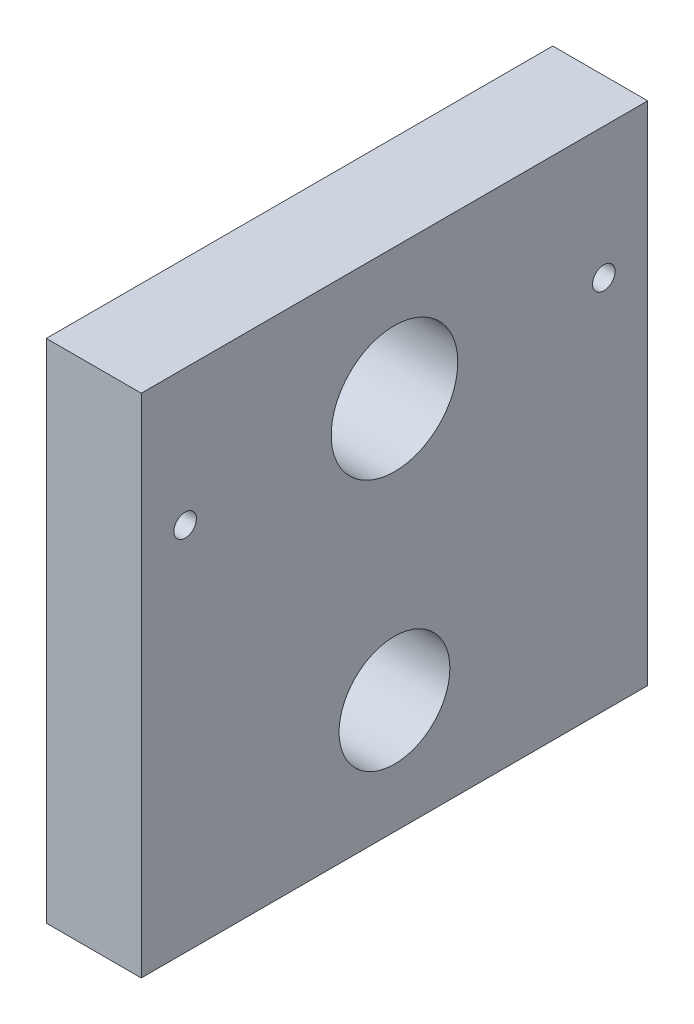
ISO-10303-21;
HEADER;
FILE_DESCRIPTION(('STEP AP214'),'2;1');
FILE_NAME('part.step','',(''),(''),'','','');
FILE_SCHEMA(('AUTOMOTIVE_DESIGN { 1 0 10303 214 1 1 1 1 }'));
ENDSEC;
DATA;
#1=APPLICATION_CONTEXT('core data for automotive mechanical design processes');
#2=APPLICATION_PROTOCOL_DEFINITION('international standard','automotive_design',2000,#1);
#3=PRODUCT_CONTEXT('',#1,'mechanical');
#4=PRODUCT('Part','Part','',(#3));
#5=PRODUCT_RELATED_PRODUCT_CATEGORY('part','',(#4));
#6=PRODUCT_DEFINITION_FORMATION('','',#4);
#7=PRODUCT_DEFINITION_CONTEXT('part definition',#1,'design');
#8=PRODUCT_DEFINITION('design','',#6,#7);
#9=PRODUCT_DEFINITION_SHAPE('','',#8);
#10=(LENGTH_UNIT() NAMED_UNIT(*) SI_UNIT(.MILLI.,.METRE.));
#11=(NAMED_UNIT(*) PLANE_ANGLE_UNIT() SI_UNIT($,.RADIAN.));
#12=(NAMED_UNIT(*) SI_UNIT($,.STERADIAN.) SOLID_ANGLE_UNIT());
#13=UNCERTAINTY_MEASURE_WITH_UNIT(LENGTH_MEASURE(1.E-05),#10,'distance_accuracy_value','');
#14=(GEOMETRIC_REPRESENTATION_CONTEXT(3) GLOBAL_UNCERTAINTY_ASSIGNED_CONTEXT((#13)) GLOBAL_UNIT_ASSIGNED_CONTEXT((#10,
#11,#12)) REPRESENTATION_CONTEXT('',''));
#15=CARTESIAN_POINT('',(0.,0.,0.));
#16=DIRECTION('',(0.,0.,1.));
#17=DIRECTION('',(1.,0.,0.));
#18=AXIS2_PLACEMENT_3D('',#15,#16,#17);
#19=CARTESIAN_POINT('',(9.525,-25.4,-25.4));
#20=DIRECTION('',(0.,0.,1.));
#21=DIRECTION('',(1.,0.,0.));
#22=AXIS2_PLACEMENT_3D('',#19,#20,#21);
#23=PLANE('',#22);
#24=CARTESIAN_POINT('',(4.7625,-19.05,-25.4));
#25=DIRECTION('',(0.,0.,-1.));
#26=DIRECTION('',(-1.,0.,0.));
#27=AXIS2_PLACEMENT_3D('',#24,#25,#26);
#28=CIRCLE('',#27,2.0193);
#29=CARTESIAN_POINT('',(2.7432,-19.05,-25.4));
#30=VERTEX_POINT('',#29);
#31=EDGE_CURVE('E101',#30,#30,#28,.T.);
#32=ORIENTED_EDGE('',*,*,#31,.F.);
#33=EDGE_LOOP('',(#32));
#34=FACE_BOUND('',#33,.T.);
#35=CARTESIAN_POINT('',(4.7625,19.05,-25.4));
#36=DIRECTION('',(0.,0.,-1.));
#37=DIRECTION('',(-1.,0.,0.));
#38=AXIS2_PLACEMENT_3D('',#35,#36,#37);
#39=CIRCLE('',#38,2.0193);
#40=CARTESIAN_POINT('',(2.7432,19.05,-25.4));
#41=VERTEX_POINT('',#40);
#42=EDGE_CURVE('E100',#41,#41,#39,.T.);
#43=ORIENTED_EDGE('',*,*,#42,.F.);
#44=EDGE_LOOP('',(#43));
#45=FACE_BOUND('',#44,.T.);
#46=DIRECTION('',(0.,1.,0.));
#47=VECTOR('',#46,1.);
#48=CARTESIAN_POINT('',(0.,-25.4,-25.4));
#49=LINE('',#48,#47);
#50=CARTESIAN_POINT('',(0.,-25.4,-25.4));
#51=VERTEX_POINT('',#50);
#52=CARTESIAN_POINT('',(0.,25.4,-25.4));
#53=VERTEX_POINT('',#52);
#54=EDGE_CURVE('E135',#51,#53,#49,.T.);
#55=ORIENTED_EDGE('',*,*,#54,.T.);
#56=DIRECTION('',(-1.,0.,0.));
#57=VECTOR('',#56,1.);
#58=CARTESIAN_POINT('',(9.525,25.4,-25.4));
#59=LINE('',#58,#57);
#60=CARTESIAN_POINT('',(9.525,25.4,-25.4));
#61=VERTEX_POINT('',#60);
#62=EDGE_CURVE('E11',#61,#53,#59,.T.);
#63=ORIENTED_EDGE('',*,*,#62,.F.);
#64=DIRECTION('',(0.,1.,0.));
#65=VECTOR('',#64,1.);
#66=CARTESIAN_POINT('',(9.525,-25.4,-25.4));
#67=LINE('',#66,#65);
#68=CARTESIAN_POINT('',(9.525,-25.4,-25.4));
#69=VERTEX_POINT('',#68);
#70=EDGE_CURVE('E136',#69,#61,#67,.T.);
#71=ORIENTED_EDGE('',*,*,#70,.F.);
#72=DIRECTION('',(-1.,0.,0.));
#73=VECTOR('',#72,1.);
#74=CARTESIAN_POINT('',(9.525,-25.4,-25.4));
#75=LINE('',#74,#73);
#76=EDGE_CURVE('E142',#69,#51,#75,.T.);
#77=ORIENTED_EDGE('',*,*,#76,.T.);
#78=EDGE_LOOP('',(#55,#63,#71,#77));
#79=FACE_BOUND('',#78,.T.);
#80=ADVANCED_FACE('F36',(#34,#45,#79),#23,.F.);
#81=CARTESIAN_POINT('',(9.525,25.4,25.4));
#82=DIRECTION('',(0.,-1.,0.));
#83=DIRECTION('',(0.,0.,-1.));
#84=AXIS2_PLACEMENT_3D('',#81,#82,#83);
#85=PLANE('',#84);
#86=DIRECTION('',(0.,0.,1.));
#87=VECTOR('',#86,1.);
#88=CARTESIAN_POINT('',(0.,25.4,25.4));
#89=LINE('',#88,#87);
#90=CARTESIAN_POINT('',(0.,25.4,25.4));
#91=VERTEX_POINT('',#90);
#92=EDGE_CURVE('E145',#53,#91,#89,.T.);
#93=ORIENTED_EDGE('',*,*,#92,.T.);
#94=DIRECTION('',(-1.,0.,0.));
#95=VECTOR('',#94,1.);
#96=CARTESIAN_POINT('',(9.525,25.4,25.4));
#97=LINE('',#96,#95);
#98=CARTESIAN_POINT('',(9.525,25.4,25.4));
#99=VERTEX_POINT('',#98);
#100=EDGE_CURVE('E44',#99,#91,#97,.T.);
#101=ORIENTED_EDGE('',*,*,#100,.F.);
#102=DIRECTION('',(0.,0.,1.));
#103=VECTOR('',#102,1.);
#104=CARTESIAN_POINT('',(9.525,25.4,25.4));
#105=LINE('',#104,#103);
#106=EDGE_CURVE('E83',#61,#99,#105,.T.);
#107=ORIENTED_EDGE('',*,*,#106,.F.);
#108=ORIENTED_EDGE('',*,*,#62,.T.);
#109=EDGE_LOOP('',(#93,#101,#107,#108));
#110=FACE_BOUND('',#109,.T.);
#111=ADVANCED_FACE('F169',(#110),#85,.F.);
#112=CARTESIAN_POINT('',(9.525,-25.4,25.4));
#113=DIRECTION('',(0.,0.,-1.));
#114=DIRECTION('',(-1.,0.,0.));
#115=AXIS2_PLACEMENT_3D('',#112,#113,#114);
#116=PLANE('',#115);
#117=DIRECTION('',(0.,-1.,0.));
#118=VECTOR('',#117,1.);
#119=CARTESIAN_POINT('',(0.,-25.4,25.4));
#120=LINE('',#119,#118);
#121=CARTESIAN_POINT('',(0.,-25.4,25.4));
#122=VERTEX_POINT('',#121);
#123=EDGE_CURVE('E70',#91,#122,#120,.T.);
#124=ORIENTED_EDGE('',*,*,#123,.T.);
#125=DIRECTION('',(-1.,0.,0.));
#126=VECTOR('',#125,1.);
#127=CARTESIAN_POINT('',(9.525,-25.4,25.4));
#128=LINE('',#127,#126);
#129=CARTESIAN_POINT('',(9.525,-25.4,25.4));
#130=VERTEX_POINT('',#129);
#131=EDGE_CURVE('E150',#130,#122,#128,.T.);
#132=ORIENTED_EDGE('',*,*,#131,.F.);
#133=DIRECTION('',(0.,-1.,0.));
#134=VECTOR('',#133,1.);
#135=CARTESIAN_POINT('',(9.525,-25.4,25.4));
#136=LINE('',#135,#134);
#137=EDGE_CURVE('E139',#99,#130,#136,.T.);
#138=ORIENTED_EDGE('',*,*,#137,.F.);
#139=ORIENTED_EDGE('',*,*,#100,.T.);
#140=EDGE_LOOP('',(#124,#132,#138,#139));
#141=FACE_BOUND('',#140,.T.);
#142=ADVANCED_FACE('F152',(#141),#116,.F.);
#143=CARTESIAN_POINT('',(9.525,-25.4,25.4));
#144=DIRECTION('',(0.,1.,0.));
#145=DIRECTION('',(0.,0.,1.));
#146=AXIS2_PLACEMENT_3D('',#143,#144,#145);
#147=PLANE('',#146);
#148=DIRECTION('',(0.,0.,-1.));
#149=VECTOR('',#148,1.);
#150=CARTESIAN_POINT('',(0.,-25.4,25.4));
#151=LINE('',#150,#149);
#152=EDGE_CURVE('E76',#122,#51,#151,.T.);
#153=ORIENTED_EDGE('',*,*,#152,.T.);
#154=ORIENTED_EDGE('',*,*,#76,.F.);
#155=DIRECTION('',(0.,0.,-1.));
#156=VECTOR('',#155,1.);
#157=CARTESIAN_POINT('',(9.525,-25.4,25.4));
#158=LINE('',#157,#156);
#159=EDGE_CURVE('E52',#130,#69,#158,.T.);
#160=ORIENTED_EDGE('',*,*,#159,.F.);
#161=ORIENTED_EDGE('',*,*,#131,.T.);
#162=EDGE_LOOP('',(#153,#154,#160,#161));
#163=FACE_BOUND('',#162,.T.);
#164=ADVANCED_FACE('F159',(#163),#147,.F.);
#165=CARTESIAN_POINT('',(9.525,0.,0.));
#166=DIRECTION('',(-1.,0.,0.));
#167=DIRECTION('',(0.,0.,1.));
#168=AXIS2_PLACEMENT_3D('',#165,#166,#167);
#169=PLANE('',#168);
#170=CARTESIAN_POINT('',(9.525,12.2301,-21.));
#171=DIRECTION('',(1.,0.,0.));
#172=DIRECTION('',(0.,0.,-1.));
#173=AXIS2_PLACEMENT_3D('',#170,#171,#172);
#174=CIRCLE('',#173,1.13029999999999);
#175=CARTESIAN_POINT('',(9.525,12.2301,-22.1303));
#176=VERTEX_POINT('',#175);
#177=EDGE_CURVE('E111',#176,#176,#174,.T.);
#178=ORIENTED_EDGE('',*,*,#177,.F.);
#179=EDGE_LOOP('',(#178));
#180=FACE_BOUND('',#179,.T.);
#181=CARTESIAN_POINT('',(9.525,11.7414591500542,21.));
#182=DIRECTION('',(1.,0.,0.));
#183=DIRECTION('',(0.,0.,-1.));
#184=AXIS2_PLACEMENT_3D('',#181,#182,#183);
#185=CIRCLE('',#184,1.13029999999999);
#186=CARTESIAN_POINT('',(9.525,11.7414591500542,19.8697));
#187=VERTEX_POINT('',#186);
#188=EDGE_CURVE('E117',#187,#187,#185,.T.);
#189=ORIENTED_EDGE('',*,*,#188,.F.);
#190=EDGE_LOOP('',(#189));
#191=FACE_BOUND('',#190,.T.);
#192=CARTESIAN_POINT('',(9.525,12.2301,0.));
#193=DIRECTION('',(1.,0.,0.));
#194=DIRECTION('',(0.,0.,-1.));
#195=AXIS2_PLACEMENT_3D('',#192,#193,#194);
#196=CIRCLE('',#195,6.34999999999999);
#197=CARTESIAN_POINT('',(9.525,12.2301,-6.34999999999999));
#198=VERTEX_POINT('',#197);
#199=EDGE_CURVE('E123',#198,#198,#196,.T.);
#200=ORIENTED_EDGE('',*,*,#199,.F.);
#201=EDGE_LOOP('',(#200));
#202=FACE_BOUND('',#201,.T.);
#203=CARTESIAN_POINT('',(9.525,-13.97,0.));
#204=DIRECTION('',(1.,0.,0.));
#205=DIRECTION('',(0.,0.,-1.));
#206=AXIS2_PLACEMENT_3D('',#203,#204,#205);
#207=CIRCLE('',#206,5.55624999999999);
#208=CARTESIAN_POINT('',(9.525,-13.97,-5.55624999999999));
#209=VERTEX_POINT('',#208);
#210=EDGE_CURVE('E129',#209,#209,#207,.T.);
#211=ORIENTED_EDGE('',*,*,#210,.F.);
#212=EDGE_LOOP('',(#211));
#213=FACE_BOUND('',#212,.T.);
#214=ORIENTED_EDGE('',*,*,#70,.T.);
#215=ORIENTED_EDGE('',*,*,#106,.T.);
#216=ORIENTED_EDGE('',*,*,#137,.T.);
#217=ORIENTED_EDGE('',*,*,#159,.T.);
#218=EDGE_LOOP('',(#214,#215,#216,#217));
#219=FACE_BOUND('',#218,.T.);
#220=ADVANCED_FACE('F161',(#180,#191,#202,#213,#219),#169,.F.);
#221=CARTESIAN_POINT('',(0.,0.,0.));
#222=DIRECTION('',(-1.,0.,0.));
#223=DIRECTION('',(0.,0.,1.));
#224=AXIS2_PLACEMENT_3D('',#221,#222,#223);
#225=PLANE('',#224);
#226=CARTESIAN_POINT('',(0.,12.2301,-21.));
#227=DIRECTION('',(1.,0.,0.));
#228=DIRECTION('',(0.,0.,-1.));
#229=AXIS2_PLACEMENT_3D('',#226,#227,#228);
#230=CIRCLE('',#229,1.1303);
#231=CARTESIAN_POINT('',(0.,12.2301,-22.1303));
#232=VERTEX_POINT('',#231);
#233=EDGE_CURVE('E114',#232,#232,#230,.T.);
#234=ORIENTED_EDGE('',*,*,#233,.T.);
#235=EDGE_LOOP('',(#234));
#236=FACE_BOUND('',#235,.T.);
#237=CARTESIAN_POINT('',(0.,11.7414591500542,21.));
#238=DIRECTION('',(1.,0.,0.));
#239=DIRECTION('',(0.,0.,-1.));
#240=AXIS2_PLACEMENT_3D('',#237,#238,#239);
#241=CIRCLE('',#240,1.1303);
#242=CARTESIAN_POINT('',(0.,11.7414591500542,19.8697));
#243=VERTEX_POINT('',#242);
#244=EDGE_CURVE('E120',#243,#243,#241,.T.);
#245=ORIENTED_EDGE('',*,*,#244,.T.);
#246=EDGE_LOOP('',(#245));
#247=FACE_BOUND('',#246,.T.);
#248=CARTESIAN_POINT('',(0.,12.2301,0.));
#249=DIRECTION('',(-1.,0.,0.));
#250=DIRECTION('',(0.,0.,1.));
#251=AXIS2_PLACEMENT_3D('',#248,#249,#250);
#252=CIRCLE('',#251,6.34999999999999);
#253=CARTESIAN_POINT('',(0.,12.2301,6.34999999999999));
#254=VERTEX_POINT('',#253);
#255=EDGE_CURVE('E126',#254,#254,#252,.T.);
#256=ORIENTED_EDGE('',*,*,#255,.F.);
#257=EDGE_LOOP('',(#256));
#258=FACE_BOUND('',#257,.T.);
#259=CARTESIAN_POINT('',(0.,-13.97,0.));
#260=DIRECTION('',(-1.,0.,0.));
#261=DIRECTION('',(0.,0.,1.));
#262=AXIS2_PLACEMENT_3D('',#259,#260,#261);
#263=CIRCLE('',#262,5.55624999999999);
#264=CARTESIAN_POINT('',(0.,-13.97,5.55624999999998));
#265=VERTEX_POINT('',#264);
#266=EDGE_CURVE('E132',#265,#265,#263,.T.);
#267=ORIENTED_EDGE('',*,*,#266,.F.);
#268=EDGE_LOOP('',(#267));
#269=FACE_BOUND('',#268,.T.);
#270=ORIENTED_EDGE('',*,*,#54,.F.);
#271=ORIENTED_EDGE('',*,*,#152,.F.);
#272=ORIENTED_EDGE('',*,*,#123,.F.);
#273=ORIENTED_EDGE('',*,*,#92,.F.);
#274=EDGE_LOOP('',(#270,#271,#272,#273));
#275=FACE_BOUND('',#274,.T.);
#276=ADVANCED_FACE('F155',(#236,#247,#258,#269,#275),#225,.T.);
#277=CARTESIAN_POINT('',(9.525,-13.97,0.));
#278=DIRECTION('',(1.,0.,0.));
#279=DIRECTION('',(0.,0.,-1.));
#280=AXIS2_PLACEMENT_3D('',#277,#278,#279);
#281=CYLINDRICAL_SURFACE('',#280,5.55624999999999);
#282=ORIENTED_EDGE('',*,*,#266,.T.);
#283=EDGE_LOOP('',(#282));
#284=FACE_BOUND('',#283,.T.);
#285=ORIENTED_EDGE('',*,*,#210,.T.);
#286=EDGE_LOOP('',(#285));
#287=FACE_BOUND('',#286,.T.);
#288=ADVANCED_FACE('F204',(#284,#287),#281,.F.);
#289=CARTESIAN_POINT('',(9.525,12.2301,0.));
#290=DIRECTION('',(1.,0.,0.));
#291=DIRECTION('',(0.,0.,-1.));
#292=AXIS2_PLACEMENT_3D('',#289,#290,#291);
#293=CYLINDRICAL_SURFACE('',#292,6.34999999999999);
#294=ORIENTED_EDGE('',*,*,#255,.T.);
#295=EDGE_LOOP('',(#294));
#296=FACE_BOUND('',#295,.T.);
#297=ORIENTED_EDGE('',*,*,#199,.T.);
#298=EDGE_LOOP('',(#297));
#299=FACE_BOUND('',#298,.T.);
#300=ADVANCED_FACE('F200',(#296,#299),#293,.F.);
#301=CARTESIAN_POINT('',(9.525,11.7414591500542,21.));
#302=DIRECTION('',(1.,0.,0.));
#303=DIRECTION('',(0.,0.,-1.));
#304=AXIS2_PLACEMENT_3D('',#301,#302,#303);
#305=CYLINDRICAL_SURFACE('',#304,1.13029999999999);
#306=ORIENTED_EDGE('',*,*,#244,.F.);
#307=EDGE_LOOP('',(#306));
#308=FACE_BOUND('',#307,.T.);
#309=ORIENTED_EDGE('',*,*,#188,.T.);
#310=EDGE_LOOP('',(#309));
#311=FACE_BOUND('',#310,.T.);
#312=ADVANCED_FACE('F196',(#308,#311),#305,.F.);
#313=CARTESIAN_POINT('',(9.525,12.2301,-21.));
#314=DIRECTION('',(1.,0.,0.));
#315=DIRECTION('',(0.,0.,-1.));
#316=AXIS2_PLACEMENT_3D('',#313,#314,#315);
#317=CYLINDRICAL_SURFACE('',#316,1.13029999999999);
#318=ORIENTED_EDGE('',*,*,#233,.F.);
#319=EDGE_LOOP('',(#318));
#320=FACE_BOUND('',#319,.T.);
#321=ORIENTED_EDGE('',*,*,#177,.T.);
#322=EDGE_LOOP('',(#321));
#323=FACE_BOUND('',#322,.T.);
#324=ADVANCED_FACE('F188',(#320,#323),#317,.F.);
#325=CARTESIAN_POINT('',(4.7625,19.05,-13.462));
#326=DIRECTION('',(0.,0.,-1.));
#327=DIRECTION('',(-1.,0.,0.));
#328=AXIS2_PLACEMENT_3D('',#325,#326,#327);
#329=CONICAL_SURFACE('',#328,2.0193,1.02974425867665);
#330=CARTESIAN_POINT('',(4.7625,19.05,-12.2486821519976));
#331=VERTEX_POINT('',#330);
#332=VERTEX_LOOP('',#331);
#333=FACE_BOUND('',#332,.T.);
#334=CARTESIAN_POINT('',(4.7625,19.05,-13.462));
#335=DIRECTION('',(0.,0.,-1.));
#336=DIRECTION('',(-1.,0.,0.));
#337=AXIS2_PLACEMENT_3D('',#334,#335,#336);
#338=CIRCLE('',#337,2.0193);
#339=CARTESIAN_POINT('',(2.74320000000001,19.05,-13.462));
#340=VERTEX_POINT('',#339);
#341=EDGE_CURVE('E104',#340,#340,#338,.T.);
#342=ORIENTED_EDGE('',*,*,#341,.T.);
#343=EDGE_LOOP('',(#342));
#344=FACE_BOUND('',#343,.T.);
#345=ADVANCED_FACE('F182',(#333,#344),#329,.F.);
#346=CARTESIAN_POINT('',(4.7625,19.05,-25.4));
#347=DIRECTION('',(0.,0.,-1.));
#348=DIRECTION('',(-1.,0.,0.));
#349=AXIS2_PLACEMENT_3D('',#346,#347,#348);
#350=CYLINDRICAL_SURFACE('',#349,2.0193);
#351=ORIENTED_EDGE('',*,*,#341,.F.);
#352=EDGE_LOOP('',(#351));
#353=FACE_BOUND('',#352,.T.);
#354=ORIENTED_EDGE('',*,*,#42,.T.);
#355=EDGE_LOOP('',(#354));
#356=FACE_BOUND('',#355,.T.);
#357=ADVANCED_FACE('F94',(#353,#356),#350,.F.);
#358=CARTESIAN_POINT('',(4.7625,-19.05,-13.462));
#359=DIRECTION('',(0.,0.,-1.));
#360=DIRECTION('',(-1.,0.,0.));
#361=AXIS2_PLACEMENT_3D('',#358,#359,#360);
#362=CONICAL_SURFACE('',#361,2.0193,1.02974425867665);
#363=CARTESIAN_POINT('',(4.7625,-19.05,-12.2486821519976));
#364=VERTEX_POINT('',#363);
#365=VERTEX_LOOP('',#364);
#366=FACE_BOUND('',#365,.T.);
#367=CARTESIAN_POINT('',(4.7625,-19.05,-13.462));
#368=DIRECTION('',(0.,0.,-1.));
#369=DIRECTION('',(-1.,0.,0.));
#370=AXIS2_PLACEMENT_3D('',#367,#368,#369);
#371=CIRCLE('',#370,2.0193);
#372=CARTESIAN_POINT('',(2.74320000000001,-19.05,-13.462));
#373=VERTEX_POINT('',#372);
#374=EDGE_CURVE('E98',#373,#373,#371,.T.);
#375=ORIENTED_EDGE('',*,*,#374,.T.);
#376=EDGE_LOOP('',(#375));
#377=FACE_BOUND('',#376,.T.);
#378=ADVANCED_FACE('F90',(#366,#377),#362,.F.);
#379=CARTESIAN_POINT('',(4.7625,-19.05,-25.4));
#380=DIRECTION('',(0.,0.,-1.));
#381=DIRECTION('',(-1.,0.,0.));
#382=AXIS2_PLACEMENT_3D('',#379,#380,#381);
#383=CYLINDRICAL_SURFACE('',#382,2.0193);
#384=ORIENTED_EDGE('',*,*,#374,.F.);
#385=EDGE_LOOP('',(#384));
#386=FACE_BOUND('',#385,.T.);
#387=ORIENTED_EDGE('',*,*,#31,.T.);
#388=EDGE_LOOP('',(#387));
#389=FACE_BOUND('',#388,.T.);
#390=ADVANCED_FACE('F93',(#386,#389),#383,.F.);
#391=CLOSED_SHELL('',(#80,#111,#142,#164,#220,#276,#288,#300,#312,#324,#345,#357,#378,#390));
#392=MANIFOLD_SOLID_BREP('B2',#391);
#393=ADVANCED_BREP_SHAPE_REPRESENTATION('',(#18,#392),#14);
#394=SHAPE_DEFINITION_REPRESENTATION(#9,#393);
ENDSEC;
END-ISO-10303-21;
